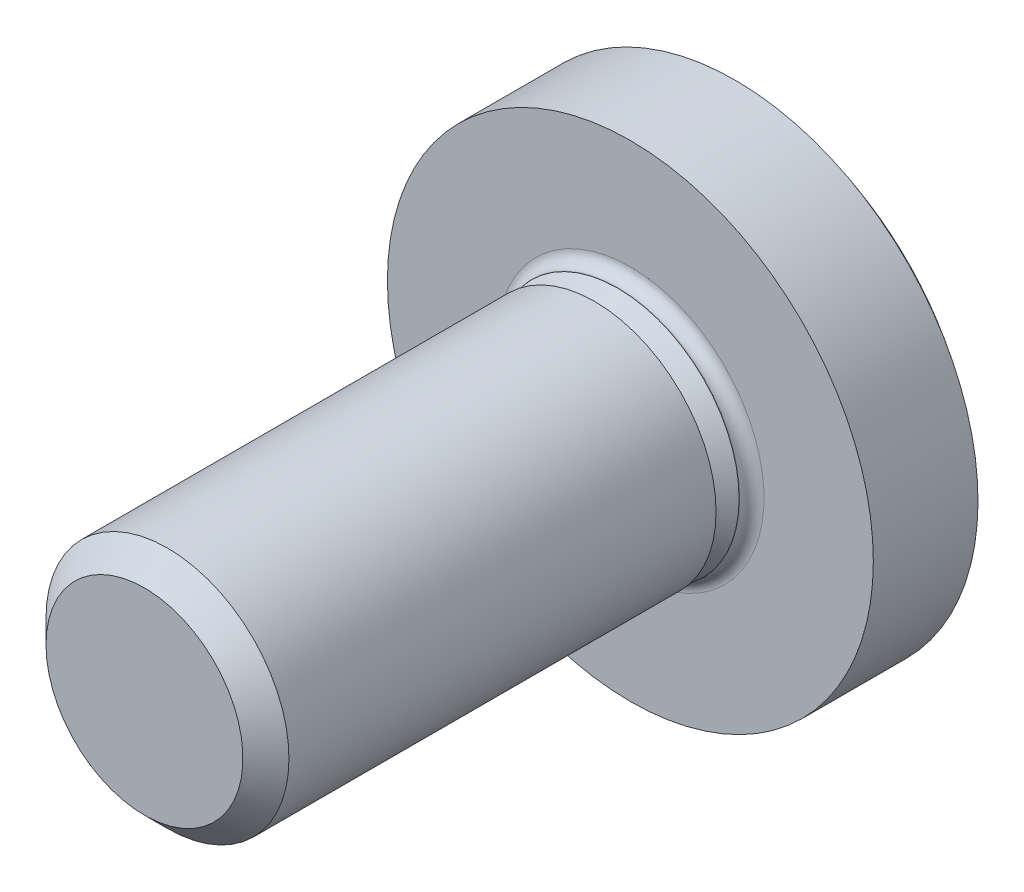
ISO-10303-21;
HEADER;
FILE_DESCRIPTION(('STEP AP214'),'2;1');
FILE_NAME('part.step','',(''),(''),'','','');
FILE_SCHEMA(('AUTOMOTIVE_DESIGN { 1 0 10303 214 1 1 1 1 }'));
ENDSEC;
DATA;
#1=APPLICATION_CONTEXT('core data for automotive mechanical design processes');
#2=APPLICATION_PROTOCOL_DEFINITION('international standard','automotive_design',2000,#1);
#3=PRODUCT_CONTEXT('',#1,'mechanical');
#4=PRODUCT('Part','Part','',(#3));
#5=PRODUCT_RELATED_PRODUCT_CATEGORY('part','',(#4));
#6=PRODUCT_DEFINITION_FORMATION('','',#4);
#7=PRODUCT_DEFINITION_CONTEXT('part definition',#1,'design');
#8=PRODUCT_DEFINITION('design','',#6,#7);
#9=PRODUCT_DEFINITION_SHAPE('','',#8);
#10=(LENGTH_UNIT() NAMED_UNIT(*) SI_UNIT(.MILLI.,.METRE.));
#11=(NAMED_UNIT(*) PLANE_ANGLE_UNIT() SI_UNIT($,.RADIAN.));
#12=(NAMED_UNIT(*) SI_UNIT($,.STERADIAN.) SOLID_ANGLE_UNIT());
#13=UNCERTAINTY_MEASURE_WITH_UNIT(LENGTH_MEASURE(1.E-05),#10,'distance_accuracy_value','');
#14=(GEOMETRIC_REPRESENTATION_CONTEXT(3) GLOBAL_UNCERTAINTY_ASSIGNED_CONTEXT((#13)) GLOBAL_UNIT_ASSIGNED_CONTEXT((#10,
#11,#12)) REPRESENTATION_CONTEXT('',''));
#15=CARTESIAN_POINT('',(0.,0.,0.));
#16=DIRECTION('',(0.,0.,1.));
#17=DIRECTION('',(1.,0.,0.));
#18=AXIS2_PLACEMENT_3D('',#15,#16,#17);
#19=CARTESIAN_POINT('',(0.,0.,6.5));
#20=DIRECTION('',(0.,0.,-1.));
#21=DIRECTION('',(0.,1.,0.));
#22=AXIS2_PLACEMENT_3D('',#19,#20,#21);
#23=SPHERICAL_SURFACE('',#22,6.5);
#24=CARTESIAN_POINT('',(0.,0.,1.3765246170202));
#25=DIRECTION('',(0.,0.,-1.));
#26=DIRECTION('',(-1.,0.,0.));
#27=AXIS2_PLACEMENT_3D('',#24,#25,#26);
#28=CIRCLE('',#27,4.);
#29=CARTESIAN_POINT('',(-4.,0.,1.3765246170202));
#30=VERTEX_POINT('',#29);
#31=EDGE_CURVE('E161',#30,#30,#28,.T.);
#32=ORIENTED_EDGE('',*,*,#31,.T.);
#33=EDGE_LOOP('',(#32));
#34=FACE_BOUND('',#33,.T.);
#35=CARTESIAN_POINT('',(-0.405545392562274,0.189108922281263,6.3801008200685));
#36=DIRECTION('',(-0.875426098065593,0.408217893676735,-0.258819045102521));
#37=DIRECTION('',(-0.422618261740699,-0.90630778703665,0.));
#38=AXIS2_PLACEMENT_3D('',#35,#36,#37);
#39=CIRCLE('',#38,6.48347090197349);
#40=CARTESIAN_POINT('',(0.92299563807694,-0.92299563807694,0.132413478861721));
#41=VERTEX_POINT('',#40);
#42=CARTESIAN_POINT('',(0.305622674506346,-2.10418012593627,0.35760463838069));
#43=VERTEX_POINT('',#42);
#44=EDGE_CURVE('E11',#41,#43,#39,.T.);
#45=ORIENTED_EDGE('',*,*,#44,.F.);
#46=CARTESIAN_POINT('',(-0.189108922281263,0.405545392562274,6.3801008200685));
#47=DIRECTION('',(-0.408217893676735,0.875426098065593,-0.258819045102521));
#48=DIRECTION('',(-0.90630778703665,-0.422618261740699,0.));
#49=AXIS2_PLACEMENT_3D('',#46,#47,#48);
#50=CIRCLE('',#49,6.48347090197349);
#51=CARTESIAN_POINT('',(2.10418012593627,-0.305622674506346,0.357604638380691));
#52=VERTEX_POINT('',#51);
#53=EDGE_CURVE('E25',#52,#41,#50,.T.);
#54=ORIENTED_EDGE('',*,*,#53,.F.);
#55=CARTESIAN_POINT('',(0.427627944162883,0.,6.61458256229943));
#56=DIRECTION('',(-0.965925826289068,0.,-0.258819045102521));
#57=DIRECTION('',(-0.258819045102521,0.,0.965925826289068));
#58=AXIS2_PLACEMENT_3D('',#55,#56,#57);
#59=CIRCLE('',#58,6.48490594980281);
#60=CARTESIAN_POINT('',(2.10418012593627,0.305622674506346,0.357604638380691));
#61=VERTEX_POINT('',#60);
#62=EDGE_CURVE('E225',#61,#52,#59,.T.);
#63=ORIENTED_EDGE('',*,*,#62,.F.);
#64=CARTESIAN_POINT('',(-0.189108922281263,-0.405545392562275,6.3801008200685));
#65=DIRECTION('',(-0.408217893676735,-0.875426098065593,-0.258819045102521));
#66=DIRECTION('',(0.90630778703665,-0.422618261740699,0.));
#67=AXIS2_PLACEMENT_3D('',#64,#65,#66);
#68=CIRCLE('',#67,6.48347090197349);
#69=CARTESIAN_POINT('',(0.922995638076941,0.922995638076939,0.132413478861721));
#70=VERTEX_POINT('',#69);
#71=EDGE_CURVE('E222',#70,#61,#68,.T.);
#72=ORIENTED_EDGE('',*,*,#71,.F.);
#73=CARTESIAN_POINT('',(-0.405545392562273,-0.189108922281263,6.3801008200685));
#74=DIRECTION('',(-0.875426098065593,-0.408217893676735,-0.258819045102521));
#75=DIRECTION('',(0.422618261740699,-0.90630778703665,0.));
#76=AXIS2_PLACEMENT_3D('',#73,#74,#75);
#77=CIRCLE('',#76,6.48347090197349);
#78=CARTESIAN_POINT('',(0.305622674506346,2.10418012593627,0.35760463838069));
#79=VERTEX_POINT('',#78);
#80=EDGE_CURVE('E219',#79,#70,#77,.T.);
#81=ORIENTED_EDGE('',*,*,#80,.F.);
#82=CARTESIAN_POINT('',(0.,0.427627944162883,6.61458256229943));
#83=DIRECTION('',(0.,-0.965925826289068,-0.258819045102521));
#84=DIRECTION('',(0.,0.258819045102521,-0.965925826289068));
#85=AXIS2_PLACEMENT_3D('',#82,#83,#84);
#86=CIRCLE('',#85,6.48490594980281);
#87=CARTESIAN_POINT('',(-0.305622674506345,2.10418012593627,0.35760463838069));
#88=VERTEX_POINT('',#87);
#89=EDGE_CURVE('E216',#88,#79,#86,.T.);
#90=ORIENTED_EDGE('',*,*,#89,.F.);
#91=CARTESIAN_POINT('',(0.405545392562275,-0.189108922281263,6.3801008200685));
#92=DIRECTION('',(0.875426098065593,-0.408217893676735,-0.258819045102521));
#93=DIRECTION('',(0.422618261740699,0.90630778703665,0.));
#94=AXIS2_PLACEMENT_3D('',#91,#92,#93);
#95=CIRCLE('',#94,6.48347090197349);
#96=CARTESIAN_POINT('',(-0.92299563807694,0.922995638076941,0.132413478861721));
#97=VERTEX_POINT('',#96);
#98=EDGE_CURVE('E213',#97,#88,#95,.T.);
#99=ORIENTED_EDGE('',*,*,#98,.F.);
#100=CARTESIAN_POINT('',(0.189108922281263,-0.405545392562273,6.3801008200685));
#101=DIRECTION('',(0.408217893676735,-0.875426098065593,-0.258819045102521));
#102=DIRECTION('',(0.90630778703665,0.422618261740699,0.));
#103=AXIS2_PLACEMENT_3D('',#100,#101,#102);
#104=CIRCLE('',#103,6.48347090197349);
#105=CARTESIAN_POINT('',(-2.10418012593627,0.305622674506346,0.35760463838069));
#106=VERTEX_POINT('',#105);
#107=EDGE_CURVE('E210',#106,#97,#104,.T.);
#108=ORIENTED_EDGE('',*,*,#107,.F.);
#109=CARTESIAN_POINT('',(-0.427627944162883,0.,6.61458256229943));
#110=DIRECTION('',(0.965925826289068,0.,-0.258819045102521));
#111=DIRECTION('',(-0.258819045102521,0.,-0.965925826289068));
#112=AXIS2_PLACEMENT_3D('',#109,#110,#111);
#113=CIRCLE('',#112,6.48490594980281);
#114=CARTESIAN_POINT('',(-2.10418012593627,-0.305622674506345,0.357604638380691));
#115=VERTEX_POINT('',#114);
#116=EDGE_CURVE('E207',#115,#106,#113,.T.);
#117=ORIENTED_EDGE('',*,*,#116,.F.);
#118=CARTESIAN_POINT('',(0.189108922281264,0.405545392562274,6.3801008200685));
#119=DIRECTION('',(0.408217893676735,0.875426098065593,-0.258819045102521));
#120=DIRECTION('',(-0.90630778703665,0.422618261740699,0.));
#121=AXIS2_PLACEMENT_3D('',#118,#119,#120);
#122=CIRCLE('',#121,6.48347090197349);
#123=CARTESIAN_POINT('',(-0.922995638076941,-0.92299563807694,0.132413478861721));
#124=VERTEX_POINT('',#123);
#125=EDGE_CURVE('E204',#124,#115,#122,.T.);
#126=ORIENTED_EDGE('',*,*,#125,.F.);
#127=CARTESIAN_POINT('',(0.405545392562273,0.189108922281263,6.3801008200685));
#128=DIRECTION('',(0.875426098065593,0.408217893676735,-0.258819045102521));
#129=DIRECTION('',(-0.422618261740699,0.90630778703665,0.));
#130=AXIS2_PLACEMENT_3D('',#127,#128,#129);
#131=CIRCLE('',#130,6.48347090197349);
#132=CARTESIAN_POINT('',(-0.305622674506346,-2.10418012593627,0.357604638380691));
#133=VERTEX_POINT('',#132);
#134=EDGE_CURVE('E201',#133,#124,#131,.T.);
#135=ORIENTED_EDGE('',*,*,#134,.F.);
#136=CARTESIAN_POINT('',(0.,-0.427627944162883,6.61458256229943));
#137=DIRECTION('',(0.,0.965925826289068,-0.258819045102521));
#138=DIRECTION('',(0.,0.258819045102521,0.965925826289068));
#139=AXIS2_PLACEMENT_3D('',#136,#137,#138);
#140=CIRCLE('',#139,6.48490594980281);
#141=EDGE_CURVE('E198',#43,#133,#140,.T.);
#142=ORIENTED_EDGE('',*,*,#141,.F.);
#143=EDGE_LOOP('',(#45,#54,#63,#72,#81,#90,#99,#108,#117,#126,#135,#142));
#144=FACE_BOUND('',#143,.T.);
#145=ADVANCED_FACE('F16',(#34,#144),#23,.T.);
#146=CARTESIAN_POINT('',(0.,0.,11.1));
#147=DIRECTION('',(0.,0.,-1.));
#148=DIRECTION('',(-1.,0.,0.));
#149=AXIS2_PLACEMENT_3D('',#146,#147,#148);
#150=PLANE('',#149);
#151=CARTESIAN_POINT('',(0.,0.,11.1));
#152=DIRECTION('',(0.,0.,-1.));
#153=DIRECTION('',(-1.,0.,0.));
#154=AXIS2_PLACEMENT_3D('',#151,#152,#153);
#155=CIRCLE('',#154,1.621125);
#156=CARTESIAN_POINT('',(-1.621125,0.,11.1));
#157=VERTEX_POINT('',#156);
#158=EDGE_CURVE('E194',#157,#157,#155,.T.);
#159=ORIENTED_EDGE('',*,*,#158,.F.);
#160=EDGE_LOOP('',(#159));
#161=FACE_BOUND('',#160,.T.);
#162=ADVANCED_FACE('F18',(#161),#150,.F.);
#163=CARTESIAN_POINT('',(0.,0.,11.1));
#164=DIRECTION('',(0.,0.,-1.));
#165=DIRECTION('',(-1.,0.,0.));
#166=AXIS2_PLACEMENT_3D('',#163,#164,#165);
#167=CONICAL_SURFACE('',#166,1.621125,0.785398163397448);
#168=CARTESIAN_POINT('',(0.,0.,10.721125));
#169=DIRECTION('',(0.,0.,-1.));
#170=DIRECTION('',(-1.,0.,0.));
#171=AXIS2_PLACEMENT_3D('',#168,#169,#170);
#172=CIRCLE('',#171,2.);
#173=CARTESIAN_POINT('',(-2.,0.,10.721125));
#174=VERTEX_POINT('',#173);
#175=EDGE_CURVE('E190',#174,#174,#172,.T.);
#176=ORIENTED_EDGE('',*,*,#175,.F.);
#177=EDGE_LOOP('',(#176));
#178=FACE_BOUND('',#177,.T.);
#179=ORIENTED_EDGE('',*,*,#158,.T.);
#180=EDGE_LOOP('',(#179));
#181=FACE_BOUND('',#180,.T.);
#182=ADVANCED_FACE('F246',(#178,#181),#167,.T.);
#183=CARTESIAN_POINT('',(0.,0.,0.));
#184=DIRECTION('',(0.,0.,-1.));
#185=DIRECTION('',(-1.,0.,0.));
#186=AXIS2_PLACEMENT_3D('',#183,#184,#185);
#187=CYLINDRICAL_SURFACE('',#186,2.);
#188=CARTESIAN_POINT('',(0.,0.,3.688875));
#189=DIRECTION('',(0.,0.,-1.));
#190=DIRECTION('',(-1.,0.,0.));
#191=AXIS2_PLACEMENT_3D('',#188,#189,#190);
#192=CIRCLE('',#191,2.);
#193=CARTESIAN_POINT('',(-2.,0.,3.688875));
#194=VERTEX_POINT('',#193);
#195=EDGE_CURVE('E186',#194,#194,#192,.T.);
#196=ORIENTED_EDGE('',*,*,#195,.F.);
#197=EDGE_LOOP('',(#196));
#198=FACE_BOUND('',#197,.T.);
#199=ORIENTED_EDGE('',*,*,#175,.T.);
#200=EDGE_LOOP('',(#199));
#201=FACE_BOUND('',#200,.T.);
#202=ADVANCED_FACE('F258',(#198,#201),#187,.T.);
#203=CARTESIAN_POINT('',(0.,2.,3.688875));
#204=DIRECTION('',(0.,0.,1.));
#205=DIRECTION('',(1.,0.,0.));
#206=AXIS2_PLACEMENT_3D('',#203,#204,#205);
#207=PLANE('',#206);
#208=CARTESIAN_POINT('',(0.,0.,3.688875));
#209=DIRECTION('',(0.,0.,-1.));
#210=DIRECTION('',(-1.,0.,0.));
#211=AXIS2_PLACEMENT_3D('',#208,#209,#210);
#212=CIRCLE('',#211,1.621125);
#213=CARTESIAN_POINT('',(-1.621125,0.,3.688875));
#214=VERTEX_POINT('',#213);
#215=EDGE_CURVE('E182',#214,#214,#212,.T.);
#216=ORIENTED_EDGE('',*,*,#215,.F.);
#217=EDGE_LOOP('',(#216));
#218=FACE_BOUND('',#217,.T.);
#219=ORIENTED_EDGE('',*,*,#195,.T.);
#220=EDGE_LOOP('',(#219));
#221=FACE_BOUND('',#220,.T.);
#222=ADVANCED_FACE('F268',(#218,#221),#207,.F.);
#223=CARTESIAN_POINT('',(0.,0.,3.688875));
#224=DIRECTION('',(0.,0.,-1.));
#225=DIRECTION('',(-1.,0.,0.));
#226=AXIS2_PLACEMENT_3D('',#223,#224,#225);
#227=CONICAL_SURFACE('',#226,1.621125,0.785398163397449);
#228=CARTESIAN_POINT('',(0.,0.,3.31));
#229=DIRECTION('',(0.,0.,-1.));
#230=DIRECTION('',(-1.,0.,0.));
#231=AXIS2_PLACEMENT_3D('',#228,#229,#230);
#232=CIRCLE('',#231,2.);
#233=CARTESIAN_POINT('',(-2.,0.,3.31));
#234=VERTEX_POINT('',#233);
#235=EDGE_CURVE('E178',#234,#234,#232,.T.);
#236=ORIENTED_EDGE('',*,*,#235,.F.);
#237=EDGE_LOOP('',(#236));
#238=FACE_BOUND('',#237,.T.);
#239=ORIENTED_EDGE('',*,*,#215,.T.);
#240=EDGE_LOOP('',(#239));
#241=FACE_BOUND('',#240,.T.);
#242=ADVANCED_FACE('F279',(#238,#241),#227,.T.);
#243=CARTESIAN_POINT('',(0.,0.,0.));
#244=DIRECTION('',(0.,0.,-1.));
#245=DIRECTION('',(-1.,0.,0.));
#246=AXIS2_PLACEMENT_3D('',#243,#244,#245);
#247=CYLINDRICAL_SURFACE('',#246,2.);
#248=CARTESIAN_POINT('',(0.,0.,3.3));
#249=DIRECTION('',(0.,0.,-1.));
#250=DIRECTION('',(-1.,0.,0.));
#251=AXIS2_PLACEMENT_3D('',#248,#249,#250);
#252=CIRCLE('',#251,2.);
#253=CARTESIAN_POINT('',(-2.,0.,3.3));
#254=VERTEX_POINT('',#253);
#255=EDGE_CURVE('E174',#254,#254,#252,.T.);
#256=ORIENTED_EDGE('',*,*,#255,.F.);
#257=EDGE_LOOP('',(#256));
#258=FACE_BOUND('',#257,.T.);
#259=ORIENTED_EDGE('',*,*,#235,.T.);
#260=EDGE_LOOP('',(#259));
#261=FACE_BOUND('',#260,.T.);
#262=ADVANCED_FACE('F290',(#258,#261),#247,.T.);
#263=CARTESIAN_POINT('',(0.,0.,3.3));
#264=DIRECTION('',(0.,0.,-1.));
#265=DIRECTION('',(-1.,0.,0.));
#266=AXIS2_PLACEMENT_3D('',#263,#264,#265);
#267=TOROIDAL_SURFACE('',#266,2.2,0.2);
#268=ORIENTED_EDGE('',*,*,#255,.T.);
#269=EDGE_LOOP('',(#268));
#270=FACE_BOUND('',#269,.T.);
#271=CARTESIAN_POINT('',(0.,0.,3.1));
#272=DIRECTION('',(0.,0.,-1.));
#273=DIRECTION('',(-1.,0.,0.));
#274=AXIS2_PLACEMENT_3D('',#271,#272,#273);
#275=CIRCLE('',#274,2.2);
#276=CARTESIAN_POINT('',(-2.2,0.,3.1));
#277=VERTEX_POINT('',#276);
#278=EDGE_CURVE('E170',#277,#277,#275,.T.);
#279=ORIENTED_EDGE('',*,*,#278,.F.);
#280=EDGE_LOOP('',(#279));
#281=FACE_BOUND('',#280,.T.);
#282=ADVANCED_FACE('F301',(#270,#281),#267,.F.);
#283=CARTESIAN_POINT('',(0.,2.2,3.1));
#284=DIRECTION('',(0.,0.,-1.));
#285=DIRECTION('',(-1.,0.,0.));
#286=AXIS2_PLACEMENT_3D('',#283,#284,#285);
#287=PLANE('',#286);
#288=CARTESIAN_POINT('',(0.,0.,3.1));
#289=DIRECTION('',(0.,0.,-1.));
#290=DIRECTION('',(-1.,0.,0.));
#291=AXIS2_PLACEMENT_3D('',#288,#289,#290);
#292=CIRCLE('',#291,4.);
#293=CARTESIAN_POINT('',(-4.,0.,3.1));
#294=VERTEX_POINT('',#293);
#295=EDGE_CURVE('E165',#294,#294,#292,.T.);
#296=ORIENTED_EDGE('',*,*,#295,.F.);
#297=EDGE_LOOP('',(#296));
#298=FACE_BOUND('',#297,.T.);
#299=ORIENTED_EDGE('',*,*,#278,.T.);
#300=EDGE_LOOP('',(#299));
#301=FACE_BOUND('',#300,.T.);
#302=ADVANCED_FACE('F312',(#298,#301),#287,.F.);
#303=CARTESIAN_POINT('',(0.,0.,0.));
#304=DIRECTION('',(0.,0.,-1.));
#305=DIRECTION('',(-1.,0.,0.));
#306=AXIS2_PLACEMENT_3D('',#303,#304,#305);
#307=CYLINDRICAL_SURFACE('',#306,4.);
#308=ORIENTED_EDGE('',*,*,#31,.F.);
#309=EDGE_LOOP('',(#308));
#310=FACE_BOUND('',#309,.T.);
#311=ORIENTED_EDGE('',*,*,#295,.T.);
#312=EDGE_LOOP('',(#311));
#313=FACE_BOUND('',#312,.T.);
#314=ADVANCED_FACE('F323',(#310,#313),#307,.T.);
#315=CARTESIAN_POINT('',(0.366666666666667,-2.2,0.));
#316=DIRECTION('',(-0.875426098065593,0.408217893676735,-0.258819045102521));
#317=DIRECTION('',(-0.422618261740699,-0.90630778703665,0.));
#318=AXIS2_PLACEMENT_3D('',#315,#316,#317);
#319=PLANE('',#318);
#320=ORIENTED_EDGE('',*,*,#44,.T.);
#321=DIRECTION('',(0.162689201767992,-0.255370893567974,-0.953057149569945));
#322=VECTOR('',#321,1.);
#323=CARTESIAN_POINT('',(0.366666666666667,-2.2,0.));
#324=LINE('',#323,#322);
#325=CARTESIAN_POINT('',(0.0423319890466869,-1.69089653438087,1.9));
#326=VERTEX_POINT('',#325);
#327=EDGE_CURVE('E32',#326,#43,#324,.T.);
#328=ORIENTED_EDGE('',*,*,#327,.F.);
#329=DIRECTION('',(0.422618261740699,0.90630778703665,0.));
#330=VECTOR('',#329,1.);
#331=CARTESIAN_POINT('',(0.149047069992156,-1.46204530477057,1.9));
#332=LINE('',#331,#330);
#333=CARTESIAN_POINT('',(0.566600049829658,-0.566600049829659,1.9));
#334=VERTEX_POINT('',#333);
#335=EDGE_CURVE('E118',#326,#334,#332,.T.);
#336=ORIENTED_EDGE('',*,*,#335,.T.);
#337=DIRECTION('',(0.193899607686987,-0.193899607686987,-0.961668281829896));
#338=VECTOR('',#337,1.);
#339=CARTESIAN_POINT('',(0.974781670177971,-0.974781670177972,-0.12442553751102));
#340=LINE('',#339,#338);
#341=EDGE_CURVE('E166',#334,#41,#340,.T.);
#342=ORIENTED_EDGE('',*,*,#341,.T.);
#343=EDGE_LOOP('',(#320,#328,#336,#342));
#344=FACE_BOUND('',#343,.T.);
#345=ADVANCED_FACE('F117',(#344),#319,.T.);
#346=CARTESIAN_POINT('',(0.949693951922647,-0.949693951922649,0.));
#347=DIRECTION('',(-0.408217893676735,0.875426098065593,-0.258819045102521));
#348=DIRECTION('',(-0.90630778703665,-0.422618261740699,0.));
#349=AXIS2_PLACEMENT_3D('',#346,#347,#348);
#350=PLANE('',#349);
#351=ORIENTED_EDGE('',*,*,#53,.T.);
#352=ORIENTED_EDGE('',*,*,#341,.F.);
#353=DIRECTION('',(0.90630778703665,0.422618261740699,0.));
#354=VECTOR('',#353,1.);
#355=CARTESIAN_POINT('',(0.177234242228863,-0.748164307737616,1.9));
#356=LINE('',#355,#354);
#357=CARTESIAN_POINT('',(1.69089653438087,-0.0423319890466872,1.9));
#358=VERTEX_POINT('',#357);
#359=EDGE_CURVE('E125',#334,#358,#356,.T.);
#360=ORIENTED_EDGE('',*,*,#359,.T.);
#361=DIRECTION('',(0.255370893567974,-0.162689201767992,-0.953057149569945));
#362=VECTOR('',#361,1.);
#363=CARTESIAN_POINT('',(2.2,-0.366666666666667,0.));
#364=LINE('',#363,#362);
#365=EDGE_CURVE('E568',#358,#52,#364,.T.);
#366=ORIENTED_EDGE('',*,*,#365,.T.);
#367=EDGE_LOOP('',(#351,#352,#360,#366));
#368=FACE_BOUND('',#367,.T.);
#369=ADVANCED_FACE('F343',(#368),#350,.T.);
#370=CARTESIAN_POINT('',(2.2,-0.366666666666667,0.));
#371=DIRECTION('',(-0.965925826289068,0.,-0.258819045102521));
#372=DIRECTION('',(-0.258819045102521,0.,0.965925826289068));
#373=AXIS2_PLACEMENT_3D('',#370,#371,#372);
#374=PLANE('',#373);
#375=ORIENTED_EDGE('',*,*,#62,.T.);
#376=ORIENTED_EDGE('',*,*,#365,.F.);
#377=DIRECTION('',(0.,1.,0.));
#378=VECTOR('',#377,1.);
#379=CARTESIAN_POINT('',(1.69089653438087,-1.67720172645669,1.9));
#380=LINE('',#379,#378);
#381=CARTESIAN_POINT('',(1.69089653438087,0.0423319890466869,1.9));
#382=VERTEX_POINT('',#381);
#383=EDGE_CURVE('E132',#358,#382,#380,.T.);
#384=ORIENTED_EDGE('',*,*,#383,.T.);
#385=DIRECTION('',(0.255370893567974,0.162689201767992,-0.953057149569945));
#386=VECTOR('',#385,1.);
#387=CARTESIAN_POINT('',(2.2,0.366666666666667,0.));
#388=LINE('',#387,#386);
#389=EDGE_CURVE('E565',#382,#61,#388,.T.);
#390=ORIENTED_EDGE('',*,*,#389,.T.);
#391=EDGE_LOOP('',(#375,#376,#384,#390));
#392=FACE_BOUND('',#391,.T.);
#393=ADVANCED_FACE('F360',(#392),#374,.T.);
#394=CARTESIAN_POINT('',(2.2,0.366666666666667,0.));
#395=DIRECTION('',(-0.408217893676735,-0.875426098065593,-0.258819045102521));
#396=DIRECTION('',(0.90630778703665,-0.422618261740699,0.));
#397=AXIS2_PLACEMENT_3D('',#394,#395,#396);
#398=PLANE('',#397);
#399=ORIENTED_EDGE('',*,*,#71,.T.);
#400=ORIENTED_EDGE('',*,*,#389,.F.);
#401=DIRECTION('',(-0.90630778703665,0.422618261740699,0.));
#402=VECTOR('',#401,1.);
#403=CARTESIAN_POINT('',(1.46204530477057,0.149047069992157,1.9));
#404=LINE('',#403,#402);
#405=CARTESIAN_POINT('',(0.566600049829659,0.566600049829658,1.9));
#406=VERTEX_POINT('',#405);
#407=EDGE_CURVE('E138',#382,#406,#404,.T.);
#408=ORIENTED_EDGE('',*,*,#407,.T.);
#409=DIRECTION('',(0.193899607686987,0.193899607686987,-0.961668281829896));
#410=VECTOR('',#409,1.);
#411=CARTESIAN_POINT('',(0.974781670177972,0.97478167017797,-0.12442553751102));
#412=LINE('',#411,#410);
#413=EDGE_CURVE('E562',#406,#70,#412,.T.);
#414=ORIENTED_EDGE('',*,*,#413,.T.);
#415=EDGE_LOOP('',(#399,#400,#408,#414));
#416=FACE_BOUND('',#415,.T.);
#417=ADVANCED_FACE('F370',(#416),#398,.T.);
#418=CARTESIAN_POINT('',(0.949693951922649,0.949693951922647,0.));
#419=DIRECTION('',(-0.875426098065593,-0.408217893676735,-0.258819045102521));
#420=DIRECTION('',(0.422618261740699,-0.90630778703665,0.));
#421=AXIS2_PLACEMENT_3D('',#418,#419,#420);
#422=PLANE('',#421);
#423=ORIENTED_EDGE('',*,*,#80,.T.);
#424=ORIENTED_EDGE('',*,*,#413,.F.);
#425=DIRECTION('',(-0.422618261740699,0.90630778703665,0.));
#426=VECTOR('',#425,1.);
#427=CARTESIAN_POINT('',(1.43385813253386,-1.29324091039736,1.9));
#428=LINE('',#427,#426);
#429=CARTESIAN_POINT('',(0.0423319890466871,1.69089653438087,1.9));
#430=VERTEX_POINT('',#429);
#431=EDGE_CURVE('E141',#406,#430,#428,.T.);
#432=ORIENTED_EDGE('',*,*,#431,.T.);
#433=DIRECTION('',(0.162689201767992,0.255370893567974,-0.953057149569945));
#434=VECTOR('',#433,1.);
#435=CARTESIAN_POINT('',(0.366666666666667,2.2,0.));
#436=LINE('',#435,#434);
#437=EDGE_CURVE('E559',#430,#79,#436,.T.);
#438=ORIENTED_EDGE('',*,*,#437,.T.);
#439=EDGE_LOOP('',(#423,#424,#432,#438));
#440=FACE_BOUND('',#439,.T.);
#441=ADVANCED_FACE('F382',(#440),#422,.T.);
#442=CARTESIAN_POINT('',(0.366666666666667,2.2,0.));
#443=DIRECTION('',(0.,-0.965925826289068,-0.258819045102521));
#444=DIRECTION('',(0.,0.258819045102521,-0.965925826289068));
#445=AXIS2_PLACEMENT_3D('',#442,#443,#444);
#446=PLANE('',#445);
#447=ORIENTED_EDGE('',*,*,#89,.T.);
#448=ORIENTED_EDGE('',*,*,#437,.F.);
#449=DIRECTION('',(-1.,0.,0.));
#450=VECTOR('',#449,1.);
#451=CARTESIAN_POINT('',(0.610451505290122,1.69089653438087,1.9));
#452=LINE('',#451,#450);
#453=CARTESIAN_POINT('',(-0.0423319890466866,1.69089653438087,1.9));
#454=VERTEX_POINT('',#453);
#455=EDGE_CURVE('E144',#430,#454,#452,.T.);
#456=ORIENTED_EDGE('',*,*,#455,.T.);
#457=DIRECTION('',(-0.162689201767992,0.255370893567974,-0.953057149569945));
#458=VECTOR('',#457,1.);
#459=CARTESIAN_POINT('',(-0.366666666666667,2.2,0.));
#460=LINE('',#459,#458);
#461=EDGE_CURVE('E556',#454,#88,#460,.T.);
#462=ORIENTED_EDGE('',*,*,#461,.T.);
#463=EDGE_LOOP('',(#447,#448,#456,#462));
#464=FACE_BOUND('',#463,.T.);
#465=ADVANCED_FACE('F394',(#464),#446,.T.);
#466=CARTESIAN_POINT('',(-0.366666666666667,2.2,0.));
#467=DIRECTION('',(0.875426098065593,-0.408217893676735,-0.258819045102521));
#468=DIRECTION('',(0.422618261740699,0.90630778703665,0.));
#469=AXIS2_PLACEMENT_3D('',#466,#467,#468);
#470=PLANE('',#469);
#471=ORIENTED_EDGE('',*,*,#98,.T.);
#472=ORIENTED_EDGE('',*,*,#461,.F.);
#473=DIRECTION('',(-0.422618261740699,-0.90630778703665,0.));
#474=VECTOR('',#473,1.);
#475=CARTESIAN_POINT('',(-1.21579729115873,-0.825607926976247,1.9));
#476=LINE('',#475,#474);
#477=CARTESIAN_POINT('',(-0.566600049829658,0.56660004982966,1.9));
#478=VERTEX_POINT('',#477);
#479=EDGE_CURVE('E147',#454,#478,#476,.T.);
#480=ORIENTED_EDGE('',*,*,#479,.T.);
#481=DIRECTION('',(-0.193899607686987,0.193899607686987,-0.961668281829896));
#482=VECTOR('',#481,1.);
#483=CARTESIAN_POINT('',(-0.97478167017797,0.974781670177972,-0.12442553751102));
#484=LINE('',#483,#482);
#485=EDGE_CURVE('E553',#478,#97,#484,.T.);
#486=ORIENTED_EDGE('',*,*,#485,.T.);
#487=EDGE_LOOP('',(#471,#472,#480,#486));
#488=FACE_BOUND('',#487,.T.);
#489=ADVANCED_FACE('F406',(#488),#470,.T.);
#490=CARTESIAN_POINT('',(-0.949693951922647,0.949693951922649,0.));
#491=DIRECTION('',(0.408217893676735,-0.875426098065593,-0.258819045102521));
#492=DIRECTION('',(0.90630778703665,0.422618261740699,0.));
#493=AXIS2_PLACEMENT_3D('',#490,#491,#492);
#494=PLANE('',#493);
#495=ORIENTED_EDGE('',*,*,#107,.T.);
#496=ORIENTED_EDGE('',*,*,#485,.F.);
#497=DIRECTION('',(-0.90630778703665,-0.422618261740699,0.));
#498=VECTOR('',#497,1.);
#499=CARTESIAN_POINT('',(-0.459203135565461,0.616680053413271,1.9));
#500=LINE('',#499,#498);
#501=CARTESIAN_POINT('',(-1.69089653438087,0.0423319890466875,1.9));
#502=VERTEX_POINT('',#501);
#503=EDGE_CURVE('E150',#478,#502,#500,.T.);
#504=ORIENTED_EDGE('',*,*,#503,.T.);
#505=DIRECTION('',(-0.255370893567974,0.162689201767992,-0.953057149569945));
#506=VECTOR('',#505,1.);
#507=CARTESIAN_POINT('',(-2.2,0.366666666666668,0.));
#508=LINE('',#507,#506);
#509=EDGE_CURVE('E550',#502,#106,#508,.T.);
#510=ORIENTED_EDGE('',*,*,#509,.T.);
#511=EDGE_LOOP('',(#495,#496,#504,#510));
#512=FACE_BOUND('',#511,.T.);
#513=ADVANCED_FACE('F418',(#512),#494,.T.);
#514=CARTESIAN_POINT('',(-2.2,0.366666666666668,0.));
#515=DIRECTION('',(0.965925826289068,0.,-0.258819045102521));
#516=DIRECTION('',(-0.258819045102521,0.,-0.965925826289068));
#517=AXIS2_PLACEMENT_3D('',#514,#515,#516);
#518=PLANE('',#517);
#519=ORIENTED_EDGE('',*,*,#116,.T.);
#520=ORIENTED_EDGE('',*,*,#509,.F.);
#521=DIRECTION('',(0.,-1.,0.));
#522=VECTOR('',#521,1.);
#523=CARTESIAN_POINT('',(-1.69089653438087,-1.67720172645669,1.9));
#524=LINE('',#523,#522);
#525=CARTESIAN_POINT('',(-1.69089653438087,-0.0423319890466864,1.9));
#526=VERTEX_POINT('',#525);
#527=EDGE_CURVE('E153',#502,#526,#524,.T.);
#528=ORIENTED_EDGE('',*,*,#527,.T.);
#529=DIRECTION('',(-0.255370893567974,-0.162689201767992,-0.953057149569945));
#530=VECTOR('',#529,1.);
#531=CARTESIAN_POINT('',(-2.2,-0.366666666666667,0.));
#532=LINE('',#531,#530);
#533=EDGE_CURVE('E545',#526,#115,#532,.T.);
#534=ORIENTED_EDGE('',*,*,#533,.T.);
#535=EDGE_LOOP('',(#519,#520,#528,#534));
#536=FACE_BOUND('',#535,.T.);
#537=ADVANCED_FACE('F430',(#536),#518,.T.);
#538=CARTESIAN_POINT('',(-2.2,-0.366666666666667,0.));
#539=DIRECTION('',(0.408217893676735,0.875426098065593,-0.258819045102521));
#540=DIRECTION('',(-0.90630778703665,0.422618261740699,0.));
#541=AXIS2_PLACEMENT_3D('',#538,#539,#540);
#542=PLANE('',#541);
#543=ORIENTED_EDGE('',*,*,#125,.T.);
#544=ORIENTED_EDGE('',*,*,#533,.F.);
#545=DIRECTION('',(0.90630778703665,-0.422618261740699,0.));
#546=VECTOR('',#545,1.);
#547=CARTESIAN_POINT('',(0.825607926976246,-1.21579729115873,1.9));
#548=LINE('',#547,#546);
#549=CARTESIAN_POINT('',(-0.56660004982966,-0.566600049829658,1.9));
#550=VERTEX_POINT('',#549);
#551=EDGE_CURVE('E156',#526,#550,#548,.T.);
#552=ORIENTED_EDGE('',*,*,#551,.T.);
#553=DIRECTION('',(-0.193899607686987,-0.193899607686987,-0.961668281829896));
#554=VECTOR('',#553,1.);
#555=CARTESIAN_POINT('',(-0.974781670177972,-0.97478167017797,-0.12442553751102));
#556=LINE('',#555,#554);
#557=EDGE_CURVE('E542',#550,#124,#556,.T.);
#558=ORIENTED_EDGE('',*,*,#557,.T.);
#559=EDGE_LOOP('',(#543,#544,#552,#558));
#560=FACE_BOUND('',#559,.T.);
#561=ADVANCED_FACE('F442',(#560),#542,.T.);
#562=CARTESIAN_POINT('',(-0.949693951922649,-0.949693951922647,0.));
#563=DIRECTION('',(0.875426098065593,0.408217893676735,-0.258819045102521));
#564=DIRECTION('',(-0.422618261740699,0.90630778703665,0.));
#565=AXIS2_PLACEMENT_3D('',#562,#563,#564);
#566=PLANE('',#565);
#567=ORIENTED_EDGE('',*,*,#134,.T.);
#568=ORIENTED_EDGE('',*,*,#557,.F.);
#569=DIRECTION('',(0.422618261740699,-0.90630778703665,0.));
#570=VECTOR('',#569,1.);
#571=CARTESIAN_POINT('',(0.0690137713829782,-1.92967828819168,1.9));
#572=LINE('',#571,#570);
#573=CARTESIAN_POINT('',(-0.0423319890466871,-1.69089653438087,1.9));
#574=VERTEX_POINT('',#573);
#575=EDGE_CURVE('E113',#550,#574,#572,.T.);
#576=ORIENTED_EDGE('',*,*,#575,.T.);
#577=DIRECTION('',(-0.162689201767992,-0.255370893567974,-0.953057149569945));
#578=VECTOR('',#577,1.);
#579=CARTESIAN_POINT('',(-0.366666666666667,-2.2,0.));
#580=LINE('',#579,#578);
#581=EDGE_CURVE('E108',#574,#133,#580,.T.);
#582=ORIENTED_EDGE('',*,*,#581,.T.);
#583=EDGE_LOOP('',(#567,#568,#576,#582));
#584=FACE_BOUND('',#583,.T.);
#585=ADVANCED_FACE('F454',(#584),#566,.T.);
#586=CARTESIAN_POINT('',(-0.366666666666667,-2.2,0.));
#587=DIRECTION('',(0.,0.965925826289068,-0.258819045102521));
#588=DIRECTION('',(0.,0.258819045102521,0.965925826289068));
#589=AXIS2_PLACEMENT_3D('',#586,#587,#588);
#590=PLANE('',#589);
#591=ORIENTED_EDGE('',*,*,#141,.T.);
#592=ORIENTED_EDGE('',*,*,#581,.F.);
#593=DIRECTION('',(1.,0.,0.));
#594=VECTOR('',#593,1.);
#595=CARTESIAN_POINT('',(0.610451505290122,-1.69089653438087,1.9));
#596=LINE('',#595,#594);
#597=EDGE_CURVE('E105',#574,#326,#596,.T.);
#598=ORIENTED_EDGE('',*,*,#597,.T.);
#599=ORIENTED_EDGE('',*,*,#327,.T.);
#600=EDGE_LOOP('',(#591,#592,#598,#599));
#601=FACE_BOUND('',#600,.T.);
#602=ADVANCED_FACE('F106',(#601),#590,.T.);
#603=CARTESIAN_POINT('',(0.610451505290122,-1.67720172645669,1.9));
#604=DIRECTION('',(0.,0.,-1.));
#605=DIRECTION('',(-1.,0.,0.));
#606=AXIS2_PLACEMENT_3D('',#603,#604,#605);
#607=PLANE('',#606);
#608=ORIENTED_EDGE('',*,*,#335,.F.);
#609=ORIENTED_EDGE('',*,*,#597,.F.);
#610=ORIENTED_EDGE('',*,*,#575,.F.);
#611=ORIENTED_EDGE('',*,*,#551,.F.);
#612=ORIENTED_EDGE('',*,*,#527,.F.);
#613=ORIENTED_EDGE('',*,*,#503,.F.);
#614=ORIENTED_EDGE('',*,*,#479,.F.);
#615=ORIENTED_EDGE('',*,*,#455,.F.);
#616=ORIENTED_EDGE('',*,*,#431,.F.);
#617=ORIENTED_EDGE('',*,*,#407,.F.);
#618=ORIENTED_EDGE('',*,*,#383,.F.);
#619=ORIENTED_EDGE('',*,*,#359,.F.);
#620=EDGE_LOOP('',(#608,#609,#610,#611,#612,#613,#614,#615,#616,#617,#618,#619));
#621=FACE_BOUND('',#620,.T.);
#622=ADVANCED_FACE('F123',(#621),#607,.T.);
#623=CLOSED_SHELL('',(#145,#162,#182,#202,#222,#242,#262,#282,#302,#314,#345,#369,#393,#417,
#441,#465,#489,#513,#537,#561,#585,#602,#622));
#624=MANIFOLD_SOLID_BREP('B1',#623);
#625=ADVANCED_BREP_SHAPE_REPRESENTATION('',(#18,#624),#14);
#626=SHAPE_DEFINITION_REPRESENTATION(#9,#625);
ENDSEC;
END-ISO-10303-21;
